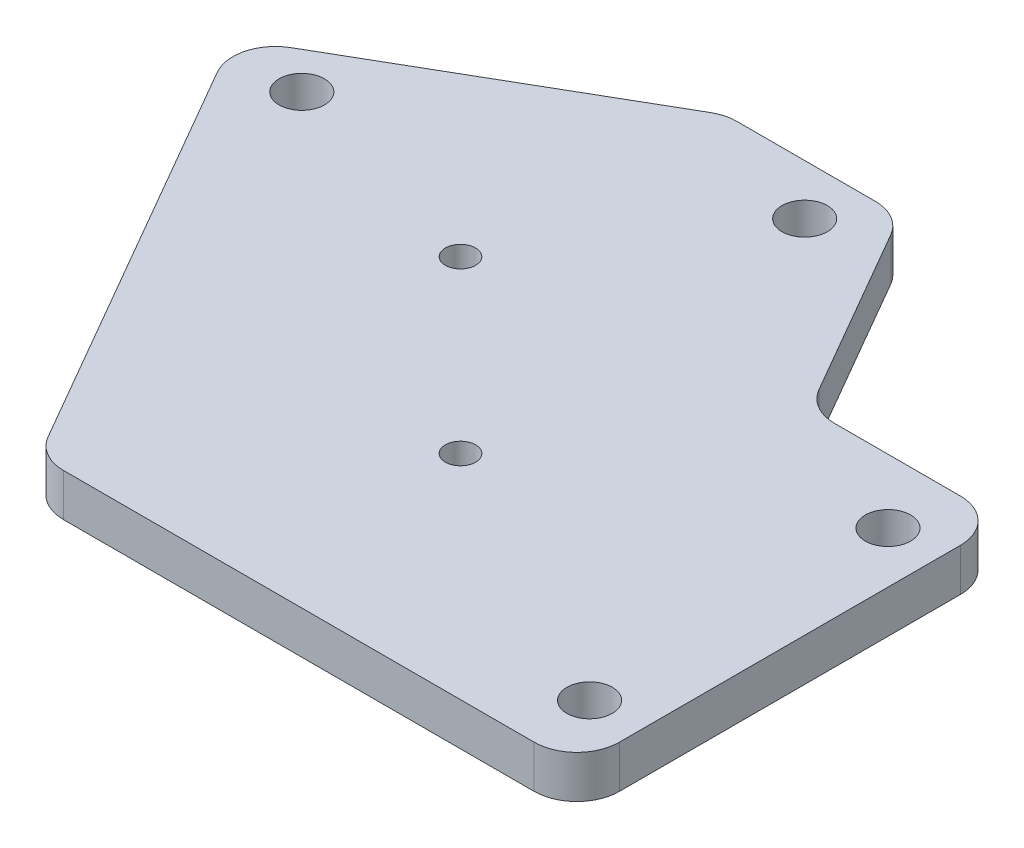
ISO-10303-21;
HEADER;
FILE_DESCRIPTION(('STEP AP214'),'2;1');
FILE_NAME('part.step','',(''),(''),'','','');
FILE_SCHEMA(('AUTOMOTIVE_DESIGN { 1 0 10303 214 1 1 1 1 }'));
ENDSEC;
DATA;
#1=APPLICATION_CONTEXT('core data for automotive mechanical design processes');
#2=APPLICATION_PROTOCOL_DEFINITION('international standard','automotive_design',2000,#1);
#3=PRODUCT_CONTEXT('',#1,'mechanical');
#4=PRODUCT('Part','Part','',(#3));
#5=PRODUCT_RELATED_PRODUCT_CATEGORY('part','',(#4));
#6=PRODUCT_DEFINITION_FORMATION('','',#4);
#7=PRODUCT_DEFINITION_CONTEXT('part definition',#1,'design');
#8=PRODUCT_DEFINITION('design','',#6,#7);
#9=PRODUCT_DEFINITION_SHAPE('','',#8);
#10=(LENGTH_UNIT() NAMED_UNIT(*) SI_UNIT(.MILLI.,.METRE.));
#11=(NAMED_UNIT(*) PLANE_ANGLE_UNIT() SI_UNIT($,.RADIAN.));
#12=(NAMED_UNIT(*) SI_UNIT($,.STERADIAN.) SOLID_ANGLE_UNIT());
#13=UNCERTAINTY_MEASURE_WITH_UNIT(LENGTH_MEASURE(1.E-05),#10,'distance_accuracy_value','');
#14=(GEOMETRIC_REPRESENTATION_CONTEXT(3) GLOBAL_UNCERTAINTY_ASSIGNED_CONTEXT((#13)) GLOBAL_UNIT_ASSIGNED_CONTEXT((#10,
#11,#12)) REPRESENTATION_CONTEXT('',''));
#15=CARTESIAN_POINT('',(0.,0.,0.));
#16=DIRECTION('',(0.,0.,1.));
#17=DIRECTION('',(1.,0.,0.));
#18=AXIS2_PLACEMENT_3D('',#15,#16,#17);
#19=CARTESIAN_POINT('',(-52.8096189432339,-6.35,-159.899999999996));
#20=DIRECTION('',(-0.499999999999996,0.,-0.866025403784441));
#21=DIRECTION('',(-0.866025403784441,0.,0.499999999999996));
#22=AXIS2_PLACEMENT_3D('',#19,#20,#21);
#23=PLANE('',#22);
#24=DIRECTION('',(-0.866025403784441,0.,0.499999999999996));
#25=VECTOR('',#24,1.);
#26=CARTESIAN_POINT('',(-52.8096189432339,-6.35,-159.899999999996));
#27=LINE('',#26,#25);
#28=CARTESIAN_POINT('',(-54.2831415712962,-6.35,-159.049261314027));
#29=VERTEX_POINT('',#28);
#30=CARTESIAN_POINT('',(-93.8444948135491,-6.35,-136.208503370107));
#31=VERTEX_POINT('',#30);
#32=EDGE_CURVE('E271',#29,#31,#27,.T.);
#33=ORIENTED_EDGE('',*,*,#32,.T.);
#34=DIRECTION('',(0.,1.,0.));
#35=VECTOR('',#34,1.);
#36=CARTESIAN_POINT('',(-93.8444948135491,-6.35,-136.208503370107));
#37=LINE('',#36,#35);
#38=CARTESIAN_POINT('',(-93.8444948135491,0.,-136.208503370107));
#39=VERTEX_POINT('',#38);
#40=EDGE_CURVE('E202',#31,#39,#37,.T.);
#41=ORIENTED_EDGE('',*,*,#40,.T.);
#42=DIRECTION('',(-0.866025403784441,0.,0.499999999999996));
#43=VECTOR('',#42,1.);
#44=CARTESIAN_POINT('',(-52.8096189432339,0.,-159.899999999996));
#45=LINE('',#44,#43);
#46=CARTESIAN_POINT('',(-54.2831415712962,0.,-159.049261314027));
#47=VERTEX_POINT('',#46);
#48=EDGE_CURVE('E146',#47,#39,#45,.T.);
#49=ORIENTED_EDGE('',*,*,#48,.F.);
#50=DIRECTION('',(0.,1.,0.));
#51=VECTOR('',#50,1.);
#52=CARTESIAN_POINT('',(-54.2831415712962,-6.35,-159.049261314027));
#53=LINE('',#52,#51);
#54=EDGE_CURVE('E200',#47,#29,#53,.F.);
#55=ORIENTED_EDGE('',*,*,#54,.T.);
#56=EDGE_LOOP('',(#33,#41,#49,#55));
#57=FACE_BOUND('',#56,.T.);
#58=ADVANCED_FACE('F39',(#57),#23,.T.);
#59=CARTESIAN_POINT('',(-26.8669541645301,-6.35,-159.899999999996));
#60=DIRECTION('',(0.,0.,-1.));
#61=DIRECTION('',(-1.,0.,0.));
#62=AXIS2_PLACEMENT_3D('',#59,#60,#61);
#63=PLANE('',#62);
#64=DIRECTION('',(-1.,0.,0.));
#65=VECTOR('',#64,1.);
#66=CARTESIAN_POINT('',(-26.8669541645301,-6.35,-159.899999999996));
#67=LINE('',#66,#65);
#68=CARTESIAN_POINT('',(-30.5331283738842,-6.35,-159.899999999996));
#69=VERTEX_POINT('',#68);
#70=CARTESIAN_POINT('',(-51.1081415712963,-6.35,-159.899999999996));
#71=VERTEX_POINT('',#70);
#72=EDGE_CURVE('E167',#69,#71,#67,.T.);
#73=ORIENTED_EDGE('',*,*,#72,.T.);
#74=DIRECTION('',(0.,1.,0.));
#75=VECTOR('',#74,1.);
#76=CARTESIAN_POINT('',(-51.1081415712963,-6.35,-159.899999999996));
#77=LINE('',#76,#75);
#78=CARTESIAN_POINT('',(-51.1081415712963,0.,-159.899999999996));
#79=VERTEX_POINT('',#78);
#80=EDGE_CURVE('E206',#71,#79,#77,.T.);
#81=ORIENTED_EDGE('',*,*,#80,.T.);
#82=DIRECTION('',(-1.,0.,0.));
#83=VECTOR('',#82,1.);
#84=CARTESIAN_POINT('',(-26.8669541645301,0.,-159.899999999996));
#85=LINE('',#84,#83);
#86=CARTESIAN_POINT('',(-30.5331283738842,0.,-159.899999999996));
#87=VERTEX_POINT('',#86);
#88=EDGE_CURVE('E175',#87,#79,#85,.T.);
#89=ORIENTED_EDGE('',*,*,#88,.F.);
#90=DIRECTION('',(0.,1.,0.));
#91=VECTOR('',#90,1.);
#92=CARTESIAN_POINT('',(-30.5331283738842,-6.35,-159.899999999996));
#93=LINE('',#92,#91);
#94=EDGE_CURVE('E204',#87,#69,#93,.F.);
#95=ORIENTED_EDGE('',*,*,#94,.T.);
#96=EDGE_LOOP('',(#73,#81,#89,#95));
#97=FACE_BOUND('',#96,.T.);
#98=ADVANCED_FACE('F345',(#97),#63,.T.);
#99=CARTESIAN_POINT('',(-8.57538953327107,-6.35,-128.218080708725));
#100=DIRECTION('',(0.866025403784441,0.,-0.499999999999996));
#101=DIRECTION('',(-0.499999999999996,0.,-0.866025403784441));
#102=AXIS2_PLACEMENT_3D('',#99,#100,#101);
#103=PLANE('',#102);
#104=DIRECTION('',(-0.499999999999996,0.,-0.866025403784441));
#105=VECTOR('',#104,1.);
#106=CARTESIAN_POINT('',(-8.57538953327107,-6.35,-128.218080708725));
#107=LINE('',#106,#105);
#108=CARTESIAN_POINT('',(-10.408476637948,-6.35,-131.393080708725));
#109=VERTEX_POINT('',#108);
#110=CARTESIAN_POINT('',(-25.033867059853,-6.35,-156.724999999996));
#111=VERTEX_POINT('',#110);
#112=EDGE_CURVE('E172',#109,#111,#107,.T.);
#113=ORIENTED_EDGE('',*,*,#112,.T.);
#114=DIRECTION('',(0.,1.,0.));
#115=VECTOR('',#114,1.);
#116=CARTESIAN_POINT('',(-25.033867059853,-6.35,-156.724999999996));
#117=LINE('',#116,#115);
#118=CARTESIAN_POINT('',(-25.033867059853,0.,-156.724999999996));
#119=VERTEX_POINT('',#118);
#120=EDGE_CURVE('E211',#111,#119,#117,.T.);
#121=ORIENTED_EDGE('',*,*,#120,.T.);
#122=DIRECTION('',(-0.499999999999996,0.,-0.866025403784441));
#123=VECTOR('',#122,1.);
#124=CARTESIAN_POINT('',(-8.57538953327107,0.,-128.218080708725));
#125=LINE('',#124,#123);
#126=CARTESIAN_POINT('',(-10.408476637948,0.,-131.393080708725));
#127=VERTEX_POINT('',#126);
#128=EDGE_CURVE('E225',#127,#119,#125,.T.);
#129=ORIENTED_EDGE('',*,*,#128,.F.);
#130=DIRECTION('',(0.,1.,0.));
#131=VECTOR('',#130,1.);
#132=CARTESIAN_POINT('',(-10.408476637948,-6.35,-131.393080708725));
#133=LINE('',#132,#131);
#134=EDGE_CURVE('E209',#127,#109,#133,.F.);
#135=ORIENTED_EDGE('',*,*,#134,.T.);
#136=EDGE_LOOP('',(#113,#121,#129,#135));
#137=FACE_BOUND('',#136,.T.);
#138=ADVANCED_FACE('F233',(#137),#103,.T.);
#139=CARTESIAN_POINT('',(20.1999999999998,-6.35,-128.218080708724));
#140=DIRECTION('',(0.,0.,-1.));
#141=DIRECTION('',(-1.,0.,0.));
#142=AXIS2_PLACEMENT_3D('',#139,#140,#141);
#143=PLANE('',#142);
#144=DIRECTION('',(-1.,0.,0.));
#145=VECTOR('',#144,1.);
#146=CARTESIAN_POINT('',(20.1999999999998,0.,-128.218080708724));
#147=LINE('',#146,#145);
#148=CARTESIAN_POINT('',(13.85,0.,-128.218080708724));
#149=VERTEX_POINT('',#148);
#150=CARTESIAN_POINT('',(-4.90921532391707,0.,-128.218080708725));
#151=VERTEX_POINT('',#150);
#152=EDGE_CURVE('E227',#149,#151,#147,.T.);
#153=ORIENTED_EDGE('',*,*,#152,.F.);
#154=DIRECTION('',(0.,1.,0.));
#155=VECTOR('',#154,1.);
#156=CARTESIAN_POINT('',(13.85,-6.35,-128.218080708724));
#157=LINE('',#156,#155);
#158=CARTESIAN_POINT('',(13.85,-6.35,-128.218080708724));
#159=VERTEX_POINT('',#158);
#160=EDGE_CURVE('E221',#149,#159,#157,.F.);
#161=ORIENTED_EDGE('',*,*,#160,.T.);
#162=DIRECTION('',(-1.,0.,0.));
#163=VECTOR('',#162,1.);
#164=CARTESIAN_POINT('',(20.1999999999998,-6.35,-128.218080708724));
#165=LINE('',#164,#163);
#166=CARTESIAN_POINT('',(-4.90921532391707,-6.35,-128.218080708725));
#167=VERTEX_POINT('',#166);
#168=EDGE_CURVE('E240',#159,#167,#165,.T.);
#169=ORIENTED_EDGE('',*,*,#168,.T.);
#170=DIRECTION('',(0.,1.,0.));
#171=VECTOR('',#170,1.);
#172=CARTESIAN_POINT('',(-4.90921532391707,0.,-128.218080708725));
#173=LINE('',#172,#171);
#174=EDGE_CURVE('E218',#167,#151,#173,.T.);
#175=ORIENTED_EDGE('',*,*,#174,.T.);
#176=EDGE_LOOP('',(#153,#161,#169,#175));
#177=FACE_BOUND('',#176,.T.);
#178=ADVANCED_FACE('F242',(#177),#143,.T.);
#179=CARTESIAN_POINT('',(20.1999999999998,-6.35,-128.218080708724));
#180=DIRECTION('',(1.,0.,0.));
#181=DIRECTION('',(0.,0.,-1.));
#182=AXIS2_PLACEMENT_3D('',#179,#180,#181);
#183=PLANE('',#182);
#184=DIRECTION('',(0.,0.,-1.));
#185=VECTOR('',#184,1.);
#186=CARTESIAN_POINT('',(20.1999999999998,-6.35,-128.218080708724));
#187=LINE('',#186,#185);
#188=CARTESIAN_POINT('',(20.1999999999998,-6.35,-71.0680807087243));
#189=VERTEX_POINT('',#188);
#190=CARTESIAN_POINT('',(20.1999999999998,-6.35,-121.868080708724));
#191=VERTEX_POINT('',#190);
#192=EDGE_CURVE('E244',#189,#191,#187,.T.);
#193=ORIENTED_EDGE('',*,*,#192,.T.);
#194=DIRECTION('',(0.,1.,0.));
#195=VECTOR('',#194,1.);
#196=CARTESIAN_POINT('',(20.1999999999998,-6.35,-121.868080708724));
#197=LINE('',#196,#195);
#198=CARTESIAN_POINT('',(20.1999999999998,0.,-121.868080708724));
#199=VERTEX_POINT('',#198);
#200=EDGE_CURVE('E215',#191,#199,#197,.T.);
#201=ORIENTED_EDGE('',*,*,#200,.T.);
#202=DIRECTION('',(0.,0.,-1.));
#203=VECTOR('',#202,1.);
#204=CARTESIAN_POINT('',(20.1999999999998,0.,-128.218080708724));
#205=LINE('',#204,#203);
#206=CARTESIAN_POINT('',(20.1999999999998,0.,-71.0680807087243));
#207=VERTEX_POINT('',#206);
#208=EDGE_CURVE('E255',#207,#199,#205,.T.);
#209=ORIENTED_EDGE('',*,*,#208,.F.);
#210=DIRECTION('',(0.,1.,0.));
#211=VECTOR('',#210,1.);
#212=CARTESIAN_POINT('',(20.1999999999998,-6.35,-71.0680807087243));
#213=LINE('',#212,#211);
#214=EDGE_CURVE('E61',#207,#189,#213,.F.);
#215=ORIENTED_EDGE('',*,*,#214,.T.);
#216=EDGE_LOOP('',(#193,#201,#209,#215));
#217=FACE_BOUND('',#216,.T.);
#218=ADVANCED_FACE('F258',(#217),#183,.T.);
#219=CARTESIAN_POINT('',(-59.901828464229,-6.35,-64.7180807087252));
#220=DIRECTION('',(0.,0.,1.));
#221=DIRECTION('',(1.,0.,0.));
#222=AXIS2_PLACEMENT_3D('',#219,#220,#221);
#223=PLANE('',#222);
#224=DIRECTION('',(1.,0.,0.));
#225=VECTOR('',#224,1.);
#226=CARTESIAN_POINT('',(-59.901828464229,0.,-64.7180807087252));
#227=LINE('',#226,#225);
#228=CARTESIAN_POINT('',(-56.2356542548749,0.,-64.7180807087252));
#229=VERTEX_POINT('',#228);
#230=CARTESIAN_POINT('',(13.8499999999997,0.,-64.7180807087243));
#231=VERTEX_POINT('',#230);
#232=EDGE_CURVE('E162',#229,#231,#227,.T.);
#233=ORIENTED_EDGE('',*,*,#232,.F.);
#234=DIRECTION('',(0.,1.,0.));
#235=VECTOR('',#234,1.);
#236=CARTESIAN_POINT('',(-56.2356542548749,-6.35,-64.7180807087252));
#237=LINE('',#236,#235);
#238=CARTESIAN_POINT('',(-56.2356542548749,-6.35,-64.7180807087252));
#239=VERTEX_POINT('',#238);
#240=EDGE_CURVE('E188',#229,#239,#237,.F.);
#241=ORIENTED_EDGE('',*,*,#240,.T.);
#242=DIRECTION('',(1.,0.,0.));
#243=VECTOR('',#242,1.);
#244=CARTESIAN_POINT('',(-59.901828464229,-6.35,-64.7180807087252));
#245=LINE('',#244,#243);
#246=CARTESIAN_POINT('',(13.8499999999997,-6.35,-64.7180807087243));
#247=VERTEX_POINT('',#246);
#248=EDGE_CURVE('E247',#239,#247,#245,.T.);
#249=ORIENTED_EDGE('',*,*,#248,.T.);
#250=DIRECTION('',(0.,1.,0.));
#251=VECTOR('',#250,1.);
#252=CARTESIAN_POINT('',(13.8499999999997,-6.35,-64.7180807087243));
#253=LINE('',#252,#251);
#254=EDGE_CURVE('E185',#247,#231,#253,.T.);
#255=ORIENTED_EDGE('',*,*,#254,.T.);
#256=EDGE_LOOP('',(#233,#241,#249,#255));
#257=FACE_BOUND('',#256,.T.);
#258=ADVANCED_FACE('F268',(#257),#223,.T.);
#259=CARTESIAN_POINT('',(-99.3437561275803,-6.35,-133.033503370107));
#260=DIRECTION('',(-0.866025403784441,0.,0.499999999999996));
#261=DIRECTION('',(0.499999999999996,0.,0.866025403784441));
#262=AXIS2_PLACEMENT_3D('',#259,#260,#261);
#263=PLANE('',#262);
#264=DIRECTION('',(0.499999999999996,0.,0.866025403784441));
#265=VECTOR('',#264,1.);
#266=CARTESIAN_POINT('',(-99.3437561275803,-6.35,-133.033503370107));
#267=LINE('',#266,#265);
#268=CARTESIAN_POINT('',(-96.1687561275803,-6.35,-127.534242056076));
#269=VERTEX_POINT('',#268);
#270=CARTESIAN_POINT('',(-61.7349155689061,-6.35,-67.8930807087252));
#271=VERTEX_POINT('',#270);
#272=EDGE_CURVE('E270',#269,#271,#267,.T.);
#273=ORIENTED_EDGE('',*,*,#272,.T.);
#274=DIRECTION('',(0.,1.,0.));
#275=VECTOR('',#274,1.);
#276=CARTESIAN_POINT('',(-61.7349155689061,-6.35,-67.8930807087252));
#277=LINE('',#276,#275);
#278=CARTESIAN_POINT('',(-61.7349155689061,0.,-67.8930807087252));
#279=VERTEX_POINT('',#278);
#280=EDGE_CURVE('E161',#271,#279,#277,.T.);
#281=ORIENTED_EDGE('',*,*,#280,.T.);
#282=DIRECTION('',(0.499999999999996,0.,0.866025403784441));
#283=VECTOR('',#282,1.);
#284=CARTESIAN_POINT('',(-99.3437561275803,0.,-133.033503370107));
#285=LINE('',#284,#283);
#286=CARTESIAN_POINT('',(-96.1687561275803,0.,-127.534242056076));
#287=VERTEX_POINT('',#286);
#288=EDGE_CURVE('E144',#287,#279,#285,.T.);
#289=ORIENTED_EDGE('',*,*,#288,.F.);
#290=DIRECTION('',(0.,1.,0.));
#291=VECTOR('',#290,1.);
#292=CARTESIAN_POINT('',(-96.1687561275803,-6.35,-127.534242056076));
#293=LINE('',#292,#291);
#294=EDGE_CURVE('E158',#287,#269,#293,.F.);
#295=ORIENTED_EDGE('',*,*,#294,.T.);
#296=EDGE_LOOP('',(#273,#281,#289,#295));
#297=FACE_BOUND('',#296,.T.);
#298=ADVANCED_FACE('F157',(#297),#263,.T.);
#299=CARTESIAN_POINT('',(0.,-6.35,0.));
#300=DIRECTION('',(0.,1.,0.));
#301=DIRECTION('',(0.,0.,1.));
#302=AXIS2_PLACEMENT_3D('',#299,#300,#301);
#303=PLANE('',#302);
#304=CARTESIAN_POINT('',(-54.2690395726502,-6.35,-121.866162863917));
#305=DIRECTION('',(0.,1.,0.));
#306=DIRECTION('',(0.,0.,1.));
#307=AXIS2_PLACEMENT_3D('',#304,#305,#306);
#308=CIRCLE('',#307,2.2479);
#309=CARTESIAN_POINT('',(-54.2690395726502,-6.35,-119.618262863917));
#310=VERTEX_POINT('',#309);
#311=EDGE_CURVE('E305',#310,#310,#308,.T.);
#312=ORIENTED_EDGE('',*,*,#311,.T.);
#313=EDGE_LOOP('',(#312));
#314=FACE_BOUND('',#313,.T.);
#315=CARTESIAN_POINT('',(-28.8728752622666,-6.35,-96.4699985535336));
#316=DIRECTION('',(0.,1.,0.));
#317=DIRECTION('',(0.,0.,1.));
#318=AXIS2_PLACEMENT_3D('',#315,#316,#317);
#319=CIRCLE('',#318,2.2479);
#320=CARTESIAN_POINT('',(-28.8728752622666,-6.35,-94.2220985535336));
#321=VERTEX_POINT('',#320);
#322=EDGE_CURVE('E299',#321,#321,#319,.T.);
#323=ORIENTED_EDGE('',*,*,#322,.T.);
#324=EDGE_LOOP('',(#323));
#325=FACE_BOUND('',#324,.T.);
#326=CARTESIAN_POINT('',(-87.3448641565334,-6.35,-131.300812841723));
#327=DIRECTION('',(0.,-1.,0.));
#328=DIRECTION('',(0.,0.,-1.));
#329=AXIS2_PLACEMENT_3D('',#326,#327,#328);
#330=CIRCLE('',#329,3.37819999999998);
#331=CARTESIAN_POINT('',(-87.3448641565334,-6.35,-134.679012841723));
#332=VERTEX_POINT('',#331);
#333=EDGE_CURVE('E296',#332,#332,#330,.T.);
#334=ORIENTED_EDGE('',*,*,#333,.F.);
#335=EDGE_LOOP('',(#334));
#336=FACE_BOUND('',#335,.T.);
#337=CARTESIAN_POINT('',(-33.5353497736704,-6.35,-152.399999999996));
#338=DIRECTION('',(0.,-1.,0.));
#339=DIRECTION('',(0.,0.,-1.));
#340=AXIS2_PLACEMENT_3D('',#337,#338,#339);
#341=CIRCLE('',#340,3.37819999999999);
#342=CARTESIAN_POINT('',(-33.5353497736704,-6.35,-155.778199999996));
#343=VERTEX_POINT('',#342);
#344=EDGE_CURVE('E290',#343,#343,#341,.T.);
#345=ORIENTED_EDGE('',*,*,#344,.F.);
#346=EDGE_LOOP('',(#345));
#347=FACE_BOUND('',#346,.T.);
#348=CARTESIAN_POINT('',(12.5799999999998,-6.35,-74.2430807087252));
#349=DIRECTION('',(0.,-1.,0.));
#350=DIRECTION('',(0.,0.,-1.));
#351=AXIS2_PLACEMENT_3D('',#348,#349,#350);
#352=CIRCLE('',#351,3.37819999999999);
#353=CARTESIAN_POINT('',(12.5799999999998,-6.35,-77.6212807087252));
#354=VERTEX_POINT('',#353);
#355=EDGE_CURVE('E284',#354,#354,#352,.T.);
#356=ORIENTED_EDGE('',*,*,#355,.F.);
#357=EDGE_LOOP('',(#356));
#358=FACE_BOUND('',#357,.T.);
#359=CARTESIAN_POINT('',(12.5799999999998,-6.35,-118.693080708724));
#360=DIRECTION('',(0.,-1.,0.));
#361=DIRECTION('',(0.,0.,-1.));
#362=AXIS2_PLACEMENT_3D('',#359,#360,#361);
#363=CIRCLE('',#362,3.37819999999999);
#364=CARTESIAN_POINT('',(12.5799999999998,-6.35,-122.071280708724));
#365=VERTEX_POINT('',#364);
#366=EDGE_CURVE('E278',#365,#365,#363,.T.);
#367=ORIENTED_EDGE('',*,*,#366,.F.);
#368=EDGE_LOOP('',(#367));
#369=FACE_BOUND('',#368,.T.);
#370=ORIENTED_EDGE('',*,*,#248,.F.);
#371=CARTESIAN_POINT('',(-56.2356542548749,-6.35,-71.0680807087252));
#372=DIRECTION('',(0.,1.,0.));
#373=DIRECTION('',(0.,0.,1.));
#374=AXIS2_PLACEMENT_3D('',#371,#372,#373);
#375=CIRCLE('',#374,6.35);
#376=EDGE_CURVE('E198',#239,#271,#375,.F.);
#377=ORIENTED_EDGE('',*,*,#376,.T.);
#378=ORIENTED_EDGE('',*,*,#272,.F.);
#379=CARTESIAN_POINT('',(-90.6694948135491,-6.35,-130.709242056076));
#380=DIRECTION('',(0.,1.,0.));
#381=DIRECTION('',(0.,0.,1.));
#382=AXIS2_PLACEMENT_3D('',#379,#380,#381);
#383=CIRCLE('',#382,6.35);
#384=EDGE_CURVE('E166',#269,#31,#383,.F.);
#385=ORIENTED_EDGE('',*,*,#384,.T.);
#386=ORIENTED_EDGE('',*,*,#32,.F.);
#387=CARTESIAN_POINT('',(-51.1081415712963,-6.35,-153.549999999996));
#388=DIRECTION('',(0.,1.,0.));
#389=DIRECTION('',(0.,0.,1.));
#390=AXIS2_PLACEMENT_3D('',#387,#388,#389);
#391=CIRCLE('',#390,6.35);
#392=EDGE_CURVE('E195',#29,#71,#391,.F.);
#393=ORIENTED_EDGE('',*,*,#392,.T.);
#394=ORIENTED_EDGE('',*,*,#72,.F.);
#395=CARTESIAN_POINT('',(-30.5331283738842,-6.35,-153.549999999996));
#396=DIRECTION('',(0.,1.,0.));
#397=DIRECTION('',(0.,0.,1.));
#398=AXIS2_PLACEMENT_3D('',#395,#396,#397);
#399=CIRCLE('',#398,6.35);
#400=EDGE_CURVE('E193',#69,#111,#399,.F.);
#401=ORIENTED_EDGE('',*,*,#400,.T.);
#402=ORIENTED_EDGE('',*,*,#112,.F.);
#403=CARTESIAN_POINT('',(-4.90921532391684,-6.35,-134.568080708725));
#404=DIRECTION('',(0.,1.,0.));
#405=DIRECTION('',(0.,0.,1.));
#406=AXIS2_PLACEMENT_3D('',#403,#404,#405);
#407=CIRCLE('',#406,6.35);
#408=EDGE_CURVE('E11',#109,#167,#407,.T.);
#409=ORIENTED_EDGE('',*,*,#408,.T.);
#410=ORIENTED_EDGE('',*,*,#168,.F.);
#411=CARTESIAN_POINT('',(13.8499999999998,-6.35,-121.868080708724));
#412=DIRECTION('',(0.,1.,0.));
#413=DIRECTION('',(0.,0.,1.));
#414=AXIS2_PLACEMENT_3D('',#411,#412,#413);
#415=CIRCLE('',#414,6.35);
#416=EDGE_CURVE('E54',#159,#191,#415,.F.);
#417=ORIENTED_EDGE('',*,*,#416,.T.);
#418=ORIENTED_EDGE('',*,*,#192,.F.);
#419=CARTESIAN_POINT('',(13.8499999999998,-6.35,-71.0680807087243));
#420=DIRECTION('',(0.,1.,0.));
#421=DIRECTION('',(0.,0.,1.));
#422=AXIS2_PLACEMENT_3D('',#419,#420,#421);
#423=CIRCLE('',#422,6.35);
#424=EDGE_CURVE('E190',#189,#247,#423,.F.);
#425=ORIENTED_EDGE('',*,*,#424,.T.);
#426=EDGE_LOOP('',(#370,#377,#378,#385,#386,#393,#394,#401,#402,#409,#410,#417,#418,#425));
#427=FACE_BOUND('',#426,.T.);
#428=ADVANCED_FACE('F239',(#314,#325,#336,#347,#358,#369,#427),#303,.F.);
#429=CARTESIAN_POINT('',(0.,0.,0.));
#430=DIRECTION('',(0.,1.,0.));
#431=DIRECTION('',(0.,0.,1.));
#432=AXIS2_PLACEMENT_3D('',#429,#430,#431);
#433=PLANE('',#432);
#434=CARTESIAN_POINT('',(-54.2690395726502,0.,-121.866162863917));
#435=DIRECTION('',(0.,1.,0.));
#436=DIRECTION('',(0.,0.,1.));
#437=AXIS2_PLACEMENT_3D('',#434,#435,#436);
#438=CIRCLE('',#437,2.2479);
#439=CARTESIAN_POINT('',(-54.2690395726502,0.,-119.618262863917));
#440=VERTEX_POINT('',#439);
#441=EDGE_CURVE('E308',#440,#440,#438,.T.);
#442=ORIENTED_EDGE('',*,*,#441,.F.);
#443=EDGE_LOOP('',(#442));
#444=FACE_BOUND('',#443,.T.);
#445=CARTESIAN_POINT('',(-28.8728752622666,0.,-96.4699985535336));
#446=DIRECTION('',(0.,1.,0.));
#447=DIRECTION('',(0.,0.,1.));
#448=AXIS2_PLACEMENT_3D('',#445,#446,#447);
#449=CIRCLE('',#448,2.2479);
#450=CARTESIAN_POINT('',(-28.8728752622666,0.,-94.2220985535336));
#451=VERTEX_POINT('',#450);
#452=EDGE_CURVE('E302',#451,#451,#449,.T.);
#453=ORIENTED_EDGE('',*,*,#452,.F.);
#454=EDGE_LOOP('',(#453));
#455=FACE_BOUND('',#454,.T.);
#456=CARTESIAN_POINT('',(-87.3448641565334,0.,-131.300812841723));
#457=DIRECTION('',(0.,-1.,0.));
#458=DIRECTION('',(0.,0.,-1.));
#459=AXIS2_PLACEMENT_3D('',#456,#457,#458);
#460=CIRCLE('',#459,3.37819999999998);
#461=CARTESIAN_POINT('',(-87.3448641565334,0.,-134.679012841723));
#462=VERTEX_POINT('',#461);
#463=EDGE_CURVE('E293',#462,#462,#460,.T.);
#464=ORIENTED_EDGE('',*,*,#463,.T.);
#465=EDGE_LOOP('',(#464));
#466=FACE_BOUND('',#465,.T.);
#467=CARTESIAN_POINT('',(-33.5353497736704,0.,-152.399999999996));
#468=DIRECTION('',(0.,-1.,0.));
#469=DIRECTION('',(0.,0.,-1.));
#470=AXIS2_PLACEMENT_3D('',#467,#468,#469);
#471=CIRCLE('',#470,3.37819999999999);
#472=CARTESIAN_POINT('',(-33.5353497736704,0.,-155.778199999996));
#473=VERTEX_POINT('',#472);
#474=EDGE_CURVE('E287',#473,#473,#471,.T.);
#475=ORIENTED_EDGE('',*,*,#474,.T.);
#476=EDGE_LOOP('',(#475));
#477=FACE_BOUND('',#476,.T.);
#478=CARTESIAN_POINT('',(12.5799999999998,0.,-74.2430807087252));
#479=DIRECTION('',(0.,-1.,0.));
#480=DIRECTION('',(0.,0.,-1.));
#481=AXIS2_PLACEMENT_3D('',#478,#479,#480);
#482=CIRCLE('',#481,3.37819999999999);
#483=CARTESIAN_POINT('',(12.5799999999998,0.,-77.6212807087252));
#484=VERTEX_POINT('',#483);
#485=EDGE_CURVE('E281',#484,#484,#482,.T.);
#486=ORIENTED_EDGE('',*,*,#485,.T.);
#487=EDGE_LOOP('',(#486));
#488=FACE_BOUND('',#487,.T.);
#489=CARTESIAN_POINT('',(12.5799999999998,0.,-118.693080708724));
#490=DIRECTION('',(0.,-1.,0.));
#491=DIRECTION('',(0.,0.,-1.));
#492=AXIS2_PLACEMENT_3D('',#489,#490,#491);
#493=CIRCLE('',#492,3.37819999999999);
#494=CARTESIAN_POINT('',(12.5799999999998,0.,-122.071280708724));
#495=VERTEX_POINT('',#494);
#496=EDGE_CURVE('E251',#495,#495,#493,.T.);
#497=ORIENTED_EDGE('',*,*,#496,.T.);
#498=EDGE_LOOP('',(#497));
#499=FACE_BOUND('',#498,.T.);
#500=ORIENTED_EDGE('',*,*,#288,.T.);
#501=CARTESIAN_POINT('',(-56.2356542548749,0.,-71.0680807087252));
#502=DIRECTION('',(0.,1.,0.));
#503=DIRECTION('',(0.,0.,1.));
#504=AXIS2_PLACEMENT_3D('',#501,#502,#503);
#505=CIRCLE('',#504,6.35);
#506=EDGE_CURVE('E151',#279,#229,#505,.T.);
#507=ORIENTED_EDGE('',*,*,#506,.T.);
#508=ORIENTED_EDGE('',*,*,#232,.T.);
#509=CARTESIAN_POINT('',(13.8499999999998,0.,-71.0680807087243));
#510=DIRECTION('',(0.,1.,0.));
#511=DIRECTION('',(0.,0.,1.));
#512=AXIS2_PLACEMENT_3D('',#509,#510,#511);
#513=CIRCLE('',#512,6.35);
#514=EDGE_CURVE('E169',#231,#207,#513,.T.);
#515=ORIENTED_EDGE('',*,*,#514,.T.);
#516=ORIENTED_EDGE('',*,*,#208,.T.);
#517=CARTESIAN_POINT('',(13.8499999999998,0.,-121.868080708724));
#518=DIRECTION('',(0.,1.,0.));
#519=DIRECTION('',(0.,0.,1.));
#520=AXIS2_PLACEMENT_3D('',#517,#518,#519);
#521=CIRCLE('',#520,6.35);
#522=EDGE_CURVE('E179',#199,#149,#521,.T.);
#523=ORIENTED_EDGE('',*,*,#522,.T.);
#524=ORIENTED_EDGE('',*,*,#152,.T.);
#525=CARTESIAN_POINT('',(-4.90921532391684,0.,-134.568080708725));
#526=DIRECTION('',(0.,1.,0.));
#527=DIRECTION('',(0.,0.,1.));
#528=AXIS2_PLACEMENT_3D('',#525,#526,#527);
#529=CIRCLE('',#528,6.35);
#530=EDGE_CURVE('E47',#151,#127,#529,.F.);
#531=ORIENTED_EDGE('',*,*,#530,.T.);
#532=ORIENTED_EDGE('',*,*,#128,.T.);
#533=CARTESIAN_POINT('',(-30.5331283738842,0.,-153.549999999996));
#534=DIRECTION('',(0.,1.,0.));
#535=DIRECTION('',(0.,0.,1.));
#536=AXIS2_PLACEMENT_3D('',#533,#534,#535);
#537=CIRCLE('',#536,6.35);
#538=EDGE_CURVE('E181',#119,#87,#537,.T.);
#539=ORIENTED_EDGE('',*,*,#538,.T.);
#540=ORIENTED_EDGE('',*,*,#88,.T.);
#541=CARTESIAN_POINT('',(-51.1081415712963,0.,-153.549999999996));
#542=DIRECTION('',(0.,1.,0.));
#543=DIRECTION('',(0.,0.,1.));
#544=AXIS2_PLACEMENT_3D('',#541,#542,#543);
#545=CIRCLE('',#544,6.35);
#546=EDGE_CURVE('E152',#79,#47,#545,.T.);
#547=ORIENTED_EDGE('',*,*,#546,.T.);
#548=ORIENTED_EDGE('',*,*,#48,.T.);
#549=CARTESIAN_POINT('',(-90.6694948135491,0.,-130.709242056076));
#550=DIRECTION('',(0.,1.,0.));
#551=DIRECTION('',(0.,0.,1.));
#552=AXIS2_PLACEMENT_3D('',#549,#550,#551);
#553=CIRCLE('',#552,6.35);
#554=EDGE_CURVE('E141',#39,#287,#553,.T.);
#555=ORIENTED_EDGE('',*,*,#554,.T.);
#556=EDGE_LOOP('',(#500,#507,#508,#515,#516,#523,#524,#531,#532,#539,#540,#547,#548,#555));
#557=FACE_BOUND('',#556,.T.);
#558=ADVANCED_FACE('F143',(#444,#455,#466,#477,#488,#499,#557),#433,.T.);
#559=CARTESIAN_POINT('',(-56.2356542548749,-6.35,-71.0680807087252));
#560=DIRECTION('',(0.,1.,0.));
#561=DIRECTION('',(0.,0.,1.));
#562=AXIS2_PLACEMENT_3D('',#559,#560,#561);
#563=CYLINDRICAL_SURFACE('',#562,6.35);
#564=ORIENTED_EDGE('',*,*,#376,.F.);
#565=ORIENTED_EDGE('',*,*,#240,.F.);
#566=ORIENTED_EDGE('',*,*,#506,.F.);
#567=ORIENTED_EDGE('',*,*,#280,.F.);
#568=EDGE_LOOP('',(#564,#565,#566,#567));
#569=FACE_BOUND('',#568,.T.);
#570=ADVANCED_FACE('F316',(#569),#563,.T.);
#571=CARTESIAN_POINT('',(-90.6694948135491,-6.35,-130.709242056076));
#572=DIRECTION('',(0.,1.,0.));
#573=DIRECTION('',(0.,0.,1.));
#574=AXIS2_PLACEMENT_3D('',#571,#572,#573);
#575=CYLINDRICAL_SURFACE('',#574,6.35);
#576=ORIENTED_EDGE('',*,*,#384,.F.);
#577=ORIENTED_EDGE('',*,*,#294,.F.);
#578=ORIENTED_EDGE('',*,*,#554,.F.);
#579=ORIENTED_EDGE('',*,*,#40,.F.);
#580=EDGE_LOOP('',(#576,#577,#578,#579));
#581=FACE_BOUND('',#580,.T.);
#582=ADVANCED_FACE('F165',(#581),#575,.T.);
#583=CARTESIAN_POINT('',(-51.1081415712963,-6.35,-153.549999999996));
#584=DIRECTION('',(0.,1.,0.));
#585=DIRECTION('',(0.,0.,1.));
#586=AXIS2_PLACEMENT_3D('',#583,#584,#585);
#587=CYLINDRICAL_SURFACE('',#586,6.35);
#588=ORIENTED_EDGE('',*,*,#392,.F.);
#589=ORIENTED_EDGE('',*,*,#54,.F.);
#590=ORIENTED_EDGE('',*,*,#546,.F.);
#591=ORIENTED_EDGE('',*,*,#80,.F.);
#592=EDGE_LOOP('',(#588,#589,#590,#591));
#593=FACE_BOUND('',#592,.T.);
#594=ADVANCED_FACE('F360',(#593),#587,.T.);
#595=CARTESIAN_POINT('',(-30.5331283738842,-6.35,-153.549999999996));
#596=DIRECTION('',(0.,1.,0.));
#597=DIRECTION('',(0.,0.,1.));
#598=AXIS2_PLACEMENT_3D('',#595,#596,#597);
#599=CYLINDRICAL_SURFACE('',#598,6.35);
#600=ORIENTED_EDGE('',*,*,#400,.F.);
#601=ORIENTED_EDGE('',*,*,#94,.F.);
#602=ORIENTED_EDGE('',*,*,#538,.F.);
#603=ORIENTED_EDGE('',*,*,#120,.F.);
#604=EDGE_LOOP('',(#600,#601,#602,#603));
#605=FACE_BOUND('',#604,.T.);
#606=ADVANCED_FACE('F363',(#605),#599,.T.);
#607=CARTESIAN_POINT('',(13.8499999999998,-6.35,-121.868080708724));
#608=DIRECTION('',(0.,1.,0.));
#609=DIRECTION('',(0.,0.,1.));
#610=AXIS2_PLACEMENT_3D('',#607,#608,#609);
#611=CYLINDRICAL_SURFACE('',#610,6.35);
#612=ORIENTED_EDGE('',*,*,#416,.F.);
#613=ORIENTED_EDGE('',*,*,#160,.F.);
#614=ORIENTED_EDGE('',*,*,#522,.F.);
#615=ORIENTED_EDGE('',*,*,#200,.F.);
#616=EDGE_LOOP('',(#612,#613,#614,#615));
#617=FACE_BOUND('',#616,.T.);
#618=ADVANCED_FACE('F367',(#617),#611,.T.);
#619=CARTESIAN_POINT('',(13.8499999999998,-6.35,-71.0680807087243));
#620=DIRECTION('',(0.,1.,0.));
#621=DIRECTION('',(0.,0.,1.));
#622=AXIS2_PLACEMENT_3D('',#619,#620,#621);
#623=CYLINDRICAL_SURFACE('',#622,6.35);
#624=ORIENTED_EDGE('',*,*,#424,.F.);
#625=ORIENTED_EDGE('',*,*,#214,.F.);
#626=ORIENTED_EDGE('',*,*,#514,.F.);
#627=ORIENTED_EDGE('',*,*,#254,.F.);
#628=EDGE_LOOP('',(#624,#625,#626,#627));
#629=FACE_BOUND('',#628,.T.);
#630=ADVANCED_FACE('F262',(#629),#623,.T.);
#631=CARTESIAN_POINT('',(-4.90921532391684,-6.35,-134.568080708725));
#632=DIRECTION('',(0.,-1.,0.));
#633=DIRECTION('',(0.,0.,-1.));
#634=AXIS2_PLACEMENT_3D('',#631,#632,#633);
#635=CYLINDRICAL_SURFACE('',#634,6.35);
#636=ORIENTED_EDGE('',*,*,#408,.F.);
#637=ORIENTED_EDGE('',*,*,#134,.F.);
#638=ORIENTED_EDGE('',*,*,#530,.F.);
#639=ORIENTED_EDGE('',*,*,#174,.F.);
#640=EDGE_LOOP('',(#636,#637,#638,#639));
#641=FACE_BOUND('',#640,.T.);
#642=ADVANCED_FACE('F41',(#641),#635,.F.);
#643=CARTESIAN_POINT('',(12.5799999999998,-6.35,-118.693080708724));
#644=DIRECTION('',(0.,-1.,0.));
#645=DIRECTION('',(0.,0.,-1.));
#646=AXIS2_PLACEMENT_3D('',#643,#644,#645);
#647=CYLINDRICAL_SURFACE('',#646,3.37819999999999);
#648=ORIENTED_EDGE('',*,*,#496,.F.);
#649=EDGE_LOOP('',(#648));
#650=FACE_BOUND('',#649,.T.);
#651=ORIENTED_EDGE('',*,*,#366,.T.);
#652=EDGE_LOOP('',(#651));
#653=FACE_BOUND('',#652,.T.);
#654=ADVANCED_FACE('F328',(#650,#653),#647,.F.);
#655=CARTESIAN_POINT('',(12.5799999999998,-6.35,-74.2430807087252));
#656=DIRECTION('',(0.,-1.,0.));
#657=DIRECTION('',(0.,0.,-1.));
#658=AXIS2_PLACEMENT_3D('',#655,#656,#657);
#659=CYLINDRICAL_SURFACE('',#658,3.37819999999999);
#660=ORIENTED_EDGE('',*,*,#485,.F.);
#661=EDGE_LOOP('',(#660));
#662=FACE_BOUND('',#661,.T.);
#663=ORIENTED_EDGE('',*,*,#355,.T.);
#664=EDGE_LOOP('',(#663));
#665=FACE_BOUND('',#664,.T.);
#666=ADVANCED_FACE('F331',(#662,#665),#659,.F.);
#667=CARTESIAN_POINT('',(-33.5353497736704,-6.35,-152.399999999996));
#668=DIRECTION('',(0.,-1.,0.));
#669=DIRECTION('',(0.,0.,-1.));
#670=AXIS2_PLACEMENT_3D('',#667,#668,#669);
#671=CYLINDRICAL_SURFACE('',#670,3.37819999999999);
#672=ORIENTED_EDGE('',*,*,#474,.F.);
#673=EDGE_LOOP('',(#672));
#674=FACE_BOUND('',#673,.T.);
#675=ORIENTED_EDGE('',*,*,#344,.T.);
#676=EDGE_LOOP('',(#675));
#677=FACE_BOUND('',#676,.T.);
#678=ADVANCED_FACE('F387',(#674,#677),#671,.F.);
#679=CARTESIAN_POINT('',(-87.3448641565334,-6.35,-131.300812841723));
#680=DIRECTION('',(0.,-1.,0.));
#681=DIRECTION('',(0.,0.,-1.));
#682=AXIS2_PLACEMENT_3D('',#679,#680,#681);
#683=CYLINDRICAL_SURFACE('',#682,3.37819999999998);
#684=ORIENTED_EDGE('',*,*,#463,.F.);
#685=EDGE_LOOP('',(#684));
#686=FACE_BOUND('',#685,.T.);
#687=ORIENTED_EDGE('',*,*,#333,.T.);
#688=EDGE_LOOP('',(#687));
#689=FACE_BOUND('',#688,.T.);
#690=ADVANCED_FACE('F394',(#686,#689),#683,.F.);
#691=CARTESIAN_POINT('',(-28.8728752622666,0.,-96.4699985535336));
#692=DIRECTION('',(0.,1.,0.));
#693=DIRECTION('',(0.,0.,1.));
#694=AXIS2_PLACEMENT_3D('',#691,#692,#693);
#695=CYLINDRICAL_SURFACE('',#694,2.2479);
#696=ORIENTED_EDGE('',*,*,#322,.F.);
#697=EDGE_LOOP('',(#696));
#698=FACE_BOUND('',#697,.T.);
#699=ORIENTED_EDGE('',*,*,#452,.T.);
#700=EDGE_LOOP('',(#699));
#701=FACE_BOUND('',#700,.T.);
#702=ADVANCED_FACE('F401',(#698,#701),#695,.F.);
#703=CARTESIAN_POINT('',(-54.2690395726502,0.,-121.866162863917));
#704=DIRECTION('',(0.,1.,0.));
#705=DIRECTION('',(0.,0.,1.));
#706=AXIS2_PLACEMENT_3D('',#703,#704,#705);
#707=CYLINDRICAL_SURFACE('',#706,2.2479);
#708=ORIENTED_EDGE('',*,*,#311,.F.);
#709=EDGE_LOOP('',(#708));
#710=FACE_BOUND('',#709,.T.);
#711=ORIENTED_EDGE('',*,*,#441,.T.);
#712=EDGE_LOOP('',(#711));
#713=FACE_BOUND('',#712,.T.);
#714=ADVANCED_FACE('F312',(#710,#713),#707,.F.);
#715=CLOSED_SHELL('',(#58,#98,#138,#178,#218,#258,#298,#428,#558,#570,#582,#594,#606,#618,#630,
#642,#654,#666,#678,#690,#702,#714));
#716=MANIFOLD_SOLID_BREP('B2',#715);
#717=ADVANCED_BREP_SHAPE_REPRESENTATION('',(#18,#716),#14);
#718=SHAPE_DEFINITION_REPRESENTATION(#9,#717);
ENDSEC;
END-ISO-10303-21;
